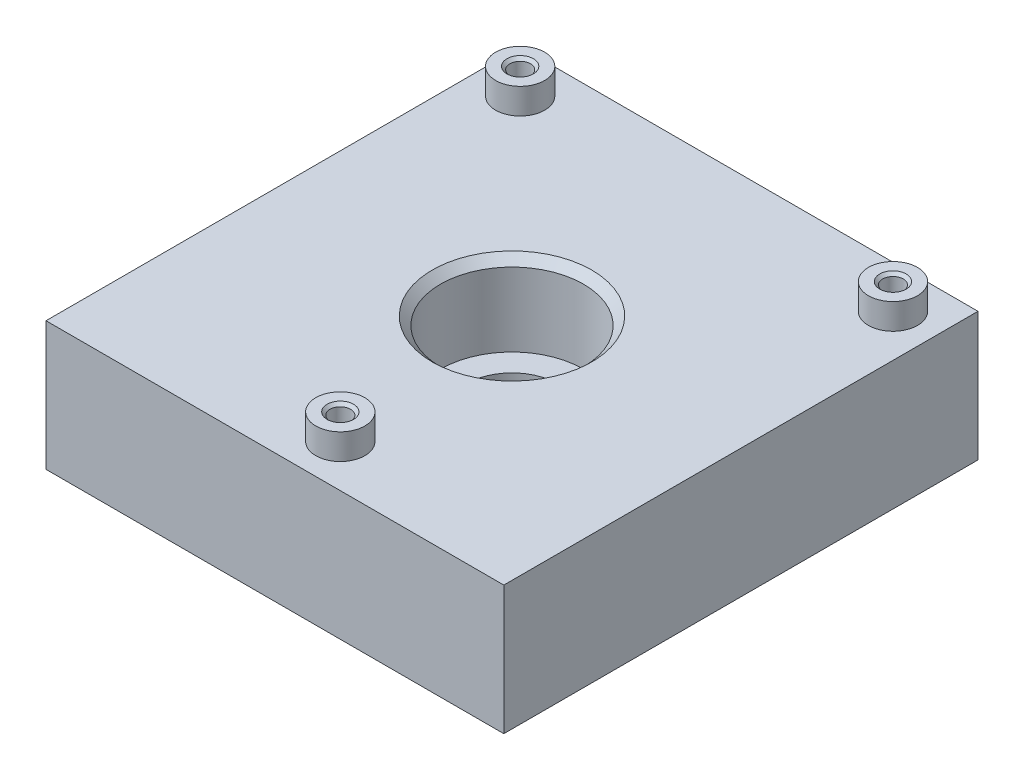
ISO-10303-21;
HEADER;
FILE_DESCRIPTION(('STEP AP214'),'2;1');
FILE_NAME('part.step','',(''),(''),'','','');
FILE_SCHEMA(('AUTOMOTIVE_DESIGN { 1 0 10303 214 1 1 1 1 }'));
ENDSEC;
DATA;
#1=APPLICATION_CONTEXT('core data for automotive mechanical design processes');
#2=APPLICATION_PROTOCOL_DEFINITION('international standard','automotive_design',2000,#1);
#3=PRODUCT_CONTEXT('',#1,'mechanical');
#4=PRODUCT('Part','Part','',(#3));
#5=PRODUCT_RELATED_PRODUCT_CATEGORY('part','',(#4));
#6=PRODUCT_DEFINITION_FORMATION('','',#4);
#7=PRODUCT_DEFINITION_CONTEXT('part definition',#1,'design');
#8=PRODUCT_DEFINITION('design','',#6,#7);
#9=PRODUCT_DEFINITION_SHAPE('','',#8);
#10=(LENGTH_UNIT() NAMED_UNIT(*) SI_UNIT(.MILLI.,.METRE.));
#11=(NAMED_UNIT(*) PLANE_ANGLE_UNIT() SI_UNIT($,.RADIAN.));
#12=(NAMED_UNIT(*) SI_UNIT($,.STERADIAN.) SOLID_ANGLE_UNIT());
#13=UNCERTAINTY_MEASURE_WITH_UNIT(LENGTH_MEASURE(1.E-05),#10,'distance_accuracy_value','');
#14=(GEOMETRIC_REPRESENTATION_CONTEXT(3) GLOBAL_UNCERTAINTY_ASSIGNED_CONTEXT((#13)) GLOBAL_UNIT_ASSIGNED_CONTEXT((#10,
#11,#12)) REPRESENTATION_CONTEXT('',''));
#15=CARTESIAN_POINT('',(0.,0.,0.));
#16=DIRECTION('',(0.,0.,1.));
#17=DIRECTION('',(1.,0.,0.));
#18=AXIS2_PLACEMENT_3D('',#15,#16,#17);
#19=CARTESIAN_POINT('',(17.78,10.,-18.415));
#20=DIRECTION('',(-1.,0.,0.));
#21=DIRECTION('',(0.,0.,1.));
#22=AXIS2_PLACEMENT_3D('',#19,#20,#21);
#23=PLANE('',#22);
#24=DIRECTION('',(0.,0.,-1.));
#25=VECTOR('',#24,1.);
#26=CARTESIAN_POINT('',(17.78,0.,-18.415));
#27=LINE('',#26,#25);
#28=CARTESIAN_POINT('',(17.78,0.,18.415));
#29=VERTEX_POINT('',#28);
#30=CARTESIAN_POINT('',(17.78,0.,-18.415));
#31=VERTEX_POINT('',#30);
#32=EDGE_CURVE('E111',#29,#31,#27,.T.);
#33=ORIENTED_EDGE('',*,*,#32,.T.);
#34=DIRECTION('',(0.,-1.,0.));
#35=VECTOR('',#34,1.);
#36=CARTESIAN_POINT('',(17.78,10.,-18.415));
#37=LINE('',#36,#35);
#38=CARTESIAN_POINT('',(17.78,10.,-18.415));
#39=VERTEX_POINT('',#38);
#40=EDGE_CURVE('E11',#39,#31,#37,.T.);
#41=ORIENTED_EDGE('',*,*,#40,.F.);
#42=DIRECTION('',(0.,0.,-1.));
#43=VECTOR('',#42,1.);
#44=CARTESIAN_POINT('',(17.78,10.,-18.415));
#45=LINE('',#44,#43);
#46=CARTESIAN_POINT('',(17.78,10.,18.415));
#47=VERTEX_POINT('',#46);
#48=EDGE_CURVE('E95',#47,#39,#45,.T.);
#49=ORIENTED_EDGE('',*,*,#48,.F.);
#50=DIRECTION('',(0.,-1.,0.));
#51=VECTOR('',#50,1.);
#52=CARTESIAN_POINT('',(17.78,10.,18.415));
#53=LINE('',#52,#51);
#54=EDGE_CURVE('E107',#47,#29,#53,.T.);
#55=ORIENTED_EDGE('',*,*,#54,.T.);
#56=EDGE_LOOP('',(#33,#41,#49,#55));
#57=FACE_BOUND('',#56,.T.);
#58=ADVANCED_FACE('F43',(#57),#23,.F.);
#59=CARTESIAN_POINT('',(-17.78,10.,-18.415));
#60=DIRECTION('',(0.,0.,1.));
#61=DIRECTION('',(1.,0.,0.));
#62=AXIS2_PLACEMENT_3D('',#59,#60,#61);
#63=PLANE('',#62);
#64=DIRECTION('',(-1.,0.,0.));
#65=VECTOR('',#64,1.);
#66=CARTESIAN_POINT('',(-17.78,0.,-18.415));
#67=LINE('',#66,#65);
#68=CARTESIAN_POINT('',(-17.78,0.,-18.415));
#69=VERTEX_POINT('',#68);
#70=EDGE_CURVE('E100',#31,#69,#67,.T.);
#71=ORIENTED_EDGE('',*,*,#70,.T.);
#72=DIRECTION('',(0.,-1.,0.));
#73=VECTOR('',#72,1.);
#74=CARTESIAN_POINT('',(-17.78,10.,-18.415));
#75=LINE('',#74,#73);
#76=CARTESIAN_POINT('',(-17.78,10.,-18.415));
#77=VERTEX_POINT('',#76);
#78=EDGE_CURVE('E52',#77,#69,#75,.T.);
#79=ORIENTED_EDGE('',*,*,#78,.F.);
#80=DIRECTION('',(-1.,0.,0.));
#81=VECTOR('',#80,1.);
#82=CARTESIAN_POINT('',(-17.78,10.,-18.415));
#83=LINE('',#82,#81);
#84=EDGE_CURVE('E90',#39,#77,#83,.T.);
#85=ORIENTED_EDGE('',*,*,#84,.F.);
#86=ORIENTED_EDGE('',*,*,#40,.T.);
#87=EDGE_LOOP('',(#71,#79,#85,#86));
#88=FACE_BOUND('',#87,.T.);
#89=ADVANCED_FACE('F99',(#88),#63,.F.);
#90=CARTESIAN_POINT('',(-17.78,10.,-18.415));
#91=DIRECTION('',(1.,0.,0.));
#92=DIRECTION('',(0.,0.,-1.));
#93=AXIS2_PLACEMENT_3D('',#90,#91,#92);
#94=PLANE('',#93);
#95=DIRECTION('',(0.,0.,1.));
#96=VECTOR('',#95,1.);
#97=CARTESIAN_POINT('',(-17.78,0.,-18.415));
#98=LINE('',#97,#96);
#99=CARTESIAN_POINT('',(-17.78,0.,18.415));
#100=VERTEX_POINT('',#99);
#101=EDGE_CURVE('E77',#69,#100,#98,.T.);
#102=ORIENTED_EDGE('',*,*,#101,.T.);
#103=DIRECTION('',(0.,-1.,0.));
#104=VECTOR('',#103,1.);
#105=CARTESIAN_POINT('',(-17.78,10.,18.415));
#106=LINE('',#105,#104);
#107=CARTESIAN_POINT('',(-17.78,10.,18.415));
#108=VERTEX_POINT('',#107);
#109=EDGE_CURVE('E102',#108,#100,#106,.T.);
#110=ORIENTED_EDGE('',*,*,#109,.F.);
#111=DIRECTION('',(0.,0.,1.));
#112=VECTOR('',#111,1.);
#113=CARTESIAN_POINT('',(-17.78,10.,-18.415));
#114=LINE('',#113,#112);
#115=EDGE_CURVE('E93',#77,#108,#114,.T.);
#116=ORIENTED_EDGE('',*,*,#115,.F.);
#117=ORIENTED_EDGE('',*,*,#78,.T.);
#118=EDGE_LOOP('',(#102,#110,#116,#117));
#119=FACE_BOUND('',#118,.T.);
#120=ADVANCED_FACE('F103',(#119),#94,.F.);
#121=CARTESIAN_POINT('',(-17.78,10.,18.415));
#122=DIRECTION('',(0.,0.,-1.));
#123=DIRECTION('',(-1.,0.,0.));
#124=AXIS2_PLACEMENT_3D('',#121,#122,#123);
#125=PLANE('',#124);
#126=DIRECTION('',(1.,0.,0.));
#127=VECTOR('',#126,1.);
#128=CARTESIAN_POINT('',(-17.78,0.,18.415));
#129=LINE('',#128,#127);
#130=EDGE_CURVE('E83',#100,#29,#129,.T.);
#131=ORIENTED_EDGE('',*,*,#130,.T.);
#132=ORIENTED_EDGE('',*,*,#54,.F.);
#133=DIRECTION('',(1.,0.,0.));
#134=VECTOR('',#133,1.);
#135=CARTESIAN_POINT('',(-17.78,10.,18.415));
#136=LINE('',#135,#134);
#137=EDGE_CURVE('E60',#108,#47,#136,.T.);
#138=ORIENTED_EDGE('',*,*,#137,.F.);
#139=ORIENTED_EDGE('',*,*,#109,.T.);
#140=EDGE_LOOP('',(#131,#132,#138,#139));
#141=FACE_BOUND('',#140,.T.);
#142=ADVANCED_FACE('F125',(#141),#125,.F.);
#143=CARTESIAN_POINT('',(0.,10.,0.));
#144=DIRECTION('',(0.,1.,0.));
#145=DIRECTION('',(0.,0.,1.));
#146=AXIS2_PLACEMENT_3D('',#143,#144,#145);
#147=PLANE('',#146);
#148=CARTESIAN_POINT('',(1.77800000000001,10.,15.113));
#149=DIRECTION('',(0.,1.,0.));
#150=DIRECTION('',(0.,0.,1.));
#151=AXIS2_PLACEMENT_3D('',#148,#149,#150);
#152=CIRCLE('',#151,1.905);
#153=CARTESIAN_POINT('',(1.77800000000001,10.,17.018));
#154=VERTEX_POINT('',#153);
#155=EDGE_CURVE('E168',#154,#154,#152,.T.);
#156=ORIENTED_EDGE('',*,*,#155,.F.);
#157=EDGE_LOOP('',(#156));
#158=FACE_BOUND('',#157,.T.);
#159=CARTESIAN_POINT('',(14.478,10.,-15.113));
#160=DIRECTION('',(0.,1.,0.));
#161=DIRECTION('',(0.,0.,1.));
#162=AXIS2_PLACEMENT_3D('',#159,#160,#161);
#163=CIRCLE('',#162,1.905);
#164=CARTESIAN_POINT('',(14.478,10.,-13.208));
#165=VERTEX_POINT('',#164);
#166=EDGE_CURVE('E160',#165,#165,#163,.T.);
#167=ORIENTED_EDGE('',*,*,#166,.F.);
#168=EDGE_LOOP('',(#167));
#169=FACE_BOUND('',#168,.T.);
#170=CARTESIAN_POINT('',(-14.478,10.,-15.113));
#171=DIRECTION('',(0.,1.,0.));
#172=DIRECTION('',(0.,0.,1.));
#173=AXIS2_PLACEMENT_3D('',#170,#171,#172);
#174=CIRCLE('',#173,1.905);
#175=CARTESIAN_POINT('',(-14.478,10.,-13.208));
#176=VERTEX_POINT('',#175);
#177=EDGE_CURVE('E152',#176,#176,#174,.T.);
#178=ORIENTED_EDGE('',*,*,#177,.F.);
#179=EDGE_LOOP('',(#178));
#180=FACE_BOUND('',#179,.T.);
#181=CARTESIAN_POINT('',(0.,10.,0.));
#182=DIRECTION('',(0.,1.,0.));
#183=DIRECTION('',(0.,0.,1.));
#184=AXIS2_PLACEMENT_3D('',#181,#182,#183);
#185=CIRCLE('',#184,6.19125);
#186=CARTESIAN_POINT('',(0.,10.,6.19125));
#187=VERTEX_POINT('',#186);
#188=EDGE_CURVE('E147',#187,#187,#185,.T.);
#189=ORIENTED_EDGE('',*,*,#188,.F.);
#190=EDGE_LOOP('',(#189));
#191=FACE_BOUND('',#190,.T.);
#192=ORIENTED_EDGE('',*,*,#48,.T.);
#193=ORIENTED_EDGE('',*,*,#84,.T.);
#194=ORIENTED_EDGE('',*,*,#115,.T.);
#195=ORIENTED_EDGE('',*,*,#137,.T.);
#196=EDGE_LOOP('',(#192,#193,#194,#195));
#197=FACE_BOUND('',#196,.T.);
#198=ADVANCED_FACE('F91',(#158,#169,#180,#191,#197),#147,.T.);
#199=CARTESIAN_POINT('',(0.,0.,0.));
#200=DIRECTION('',(0.,1.,0.));
#201=DIRECTION('',(0.,0.,1.));
#202=AXIS2_PLACEMENT_3D('',#199,#200,#201);
#203=PLANE('',#202);
#204=CARTESIAN_POINT('',(-14.478,0.,-15.113));
#205=DIRECTION('',(0.,1.,0.));
#206=DIRECTION('',(0.,0.,1.));
#207=AXIS2_PLACEMENT_3D('',#204,#205,#206);
#208=CIRCLE('',#207,0.799999999999997);
#209=CARTESIAN_POINT('',(-14.478,0.,-14.313));
#210=VERTEX_POINT('',#209);
#211=EDGE_CURVE('E199',#210,#210,#208,.T.);
#212=ORIENTED_EDGE('',*,*,#211,.T.);
#213=EDGE_LOOP('',(#212));
#214=FACE_BOUND('',#213,.T.);
#215=CARTESIAN_POINT('',(14.478,0.,-15.113));
#216=DIRECTION('',(0.,1.,0.));
#217=DIRECTION('',(0.,0.,1.));
#218=AXIS2_PLACEMENT_3D('',#215,#216,#217);
#219=CIRCLE('',#218,0.799999999999997);
#220=CARTESIAN_POINT('',(14.478,0.,-14.313));
#221=VERTEX_POINT('',#220);
#222=EDGE_CURVE('E187',#221,#221,#219,.T.);
#223=ORIENTED_EDGE('',*,*,#222,.T.);
#224=EDGE_LOOP('',(#223));
#225=FACE_BOUND('',#224,.T.);
#226=CARTESIAN_POINT('',(1.77800000000001,0.,15.113));
#227=DIRECTION('',(0.,1.,0.));
#228=DIRECTION('',(0.,0.,1.));
#229=AXIS2_PLACEMENT_3D('',#226,#227,#228);
#230=CIRCLE('',#229,0.799999999999997);
#231=CARTESIAN_POINT('',(1.77800000000001,0.,15.913));
#232=VERTEX_POINT('',#231);
#233=EDGE_CURVE('E172',#232,#232,#230,.T.);
#234=ORIENTED_EDGE('',*,*,#233,.T.);
#235=EDGE_LOOP('',(#234));
#236=FACE_BOUND('',#235,.T.);
#237=CARTESIAN_POINT('',(0.,0.,0.));
#238=DIRECTION('',(0.,1.,0.));
#239=DIRECTION('',(0.,0.,1.));
#240=AXIS2_PLACEMENT_3D('',#237,#238,#239);
#241=CIRCLE('',#240,3.57124);
#242=CARTESIAN_POINT('',(0.,0.,3.57124));
#243=VERTEX_POINT('',#242);
#244=EDGE_CURVE('E115',#243,#243,#241,.T.);
#245=ORIENTED_EDGE('',*,*,#244,.T.);
#246=EDGE_LOOP('',(#245));
#247=FACE_BOUND('',#246,.T.);
#248=ORIENTED_EDGE('',*,*,#32,.F.);
#249=ORIENTED_EDGE('',*,*,#130,.F.);
#250=ORIENTED_EDGE('',*,*,#101,.F.);
#251=ORIENTED_EDGE('',*,*,#70,.F.);
#252=EDGE_LOOP('',(#248,#249,#250,#251));
#253=FACE_BOUND('',#252,.T.);
#254=ADVANCED_FACE('F128',(#214,#225,#236,#247,#253),#203,.F.);
#255=CARTESIAN_POINT('',(0.,10.,0.));
#256=DIRECTION('',(0.,1.,0.));
#257=DIRECTION('',(0.,0.,1.));
#258=AXIS2_PLACEMENT_3D('',#255,#256,#257);
#259=CYLINDRICAL_SURFACE('',#258,3.57124);
#260=ORIENTED_EDGE('',*,*,#244,.F.);
#261=EDGE_LOOP('',(#260));
#262=FACE_BOUND('',#261,.T.);
#263=CARTESIAN_POINT('',(0.,3.65,0.));
#264=DIRECTION('',(0.,1.,0.));
#265=DIRECTION('',(0.,0.,1.));
#266=AXIS2_PLACEMENT_3D('',#263,#264,#265);
#267=CIRCLE('',#266,3.57124);
#268=CARTESIAN_POINT('',(0.,3.65,3.57124));
#269=VERTEX_POINT('',#268);
#270=EDGE_CURVE('E135',#269,#269,#267,.T.);
#271=ORIENTED_EDGE('',*,*,#270,.T.);
#272=EDGE_LOOP('',(#271));
#273=FACE_BOUND('',#272,.T.);
#274=ADVANCED_FACE('F257',(#262,#273),#259,.F.);
#275=CARTESIAN_POINT('',(5.55625,3.65,0.));
#276=DIRECTION('',(0.,-1.,0.));
#277=DIRECTION('',(0.,0.,-1.));
#278=AXIS2_PLACEMENT_3D('',#275,#276,#277);
#279=PLANE('',#278);
#280=ORIENTED_EDGE('',*,*,#270,.F.);
#281=EDGE_LOOP('',(#280));
#282=FACE_BOUND('',#281,.T.);
#283=CARTESIAN_POINT('',(0.,3.65,0.));
#284=DIRECTION('',(0.,1.,0.));
#285=DIRECTION('',(0.,0.,1.));
#286=AXIS2_PLACEMENT_3D('',#283,#284,#285);
#287=CIRCLE('',#286,5.55625);
#288=CARTESIAN_POINT('',(0.,3.65,5.55625));
#289=VERTEX_POINT('',#288);
#290=EDGE_CURVE('E139',#289,#289,#287,.T.);
#291=ORIENTED_EDGE('',*,*,#290,.T.);
#292=EDGE_LOOP('',(#291));
#293=FACE_BOUND('',#292,.T.);
#294=ADVANCED_FACE('F241',(#282,#293),#279,.F.);
#295=CARTESIAN_POINT('',(0.,10.,0.));
#296=DIRECTION('',(0.,1.,0.));
#297=DIRECTION('',(0.,0.,1.));
#298=AXIS2_PLACEMENT_3D('',#295,#296,#297);
#299=CYLINDRICAL_SURFACE('',#298,5.55625);
#300=ORIENTED_EDGE('',*,*,#290,.F.);
#301=EDGE_LOOP('',(#300));
#302=FACE_BOUND('',#301,.T.);
#303=CARTESIAN_POINT('',(0.,9.365,0.));
#304=DIRECTION('',(0.,1.,0.));
#305=DIRECTION('',(0.,0.,1.));
#306=AXIS2_PLACEMENT_3D('',#303,#304,#305);
#307=CIRCLE('',#306,5.55625);
#308=CARTESIAN_POINT('',(0.,9.365,5.55625));
#309=VERTEX_POINT('',#308);
#310=EDGE_CURVE('E143',#309,#309,#307,.T.);
#311=ORIENTED_EDGE('',*,*,#310,.T.);
#312=EDGE_LOOP('',(#311));
#313=FACE_BOUND('',#312,.T.);
#314=ADVANCED_FACE('F235',(#302,#313),#299,.F.);
#315=CARTESIAN_POINT('',(0.,10.,0.));
#316=DIRECTION('',(0.,1.,0.));
#317=DIRECTION('',(0.,0.,1.));
#318=AXIS2_PLACEMENT_3D('',#315,#316,#317);
#319=CONICAL_SURFACE('',#318,6.19125,0.78539816339745);
#320=ORIENTED_EDGE('',*,*,#310,.F.);
#321=EDGE_LOOP('',(#320));
#322=FACE_BOUND('',#321,.T.);
#323=ORIENTED_EDGE('',*,*,#188,.T.);
#324=EDGE_LOOP('',(#323));
#325=FACE_BOUND('',#324,.T.);
#326=ADVANCED_FACE('F224',(#322,#325),#319,.F.);
#327=CARTESIAN_POINT('',(-14.478,12.,-15.113));
#328=DIRECTION('',(0.,-1.,0.));
#329=DIRECTION('',(0.,0.,-1.));
#330=AXIS2_PLACEMENT_3D('',#327,#328,#329);
#331=CYLINDRICAL_SURFACE('',#330,1.905);
#332=CARTESIAN_POINT('',(-14.478,12.,-15.113));
#333=DIRECTION('',(0.,1.,0.));
#334=DIRECTION('',(0.,0.,1.));
#335=AXIS2_PLACEMENT_3D('',#332,#333,#334);
#336=CIRCLE('',#335,1.905);
#337=CARTESIAN_POINT('',(-14.478,12.,-13.208));
#338=VERTEX_POINT('',#337);
#339=EDGE_CURVE('E151',#338,#338,#336,.T.);
#340=ORIENTED_EDGE('',*,*,#339,.F.);
#341=EDGE_LOOP('',(#340));
#342=FACE_BOUND('',#341,.T.);
#343=ORIENTED_EDGE('',*,*,#177,.T.);
#344=EDGE_LOOP('',(#343));
#345=FACE_BOUND('',#344,.T.);
#346=ADVANCED_FACE('F218',(#342,#345),#331,.T.);
#347=CARTESIAN_POINT('',(-14.478,12.,-15.113));
#348=DIRECTION('',(0.,1.,0.));
#349=DIRECTION('',(0.,0.,1.));
#350=AXIS2_PLACEMENT_3D('',#347,#348,#349);
#351=PLANE('',#350);
#352=CARTESIAN_POINT('',(-14.478,12.,-15.113));
#353=DIRECTION('',(0.,1.,0.));
#354=DIRECTION('',(0.,0.,1.));
#355=AXIS2_PLACEMENT_3D('',#352,#353,#354);
#356=CIRCLE('',#355,1.025);
#357=CARTESIAN_POINT('',(-14.478,12.,-14.088));
#358=VERTEX_POINT('',#357);
#359=EDGE_CURVE('E207',#358,#358,#356,.T.);
#360=ORIENTED_EDGE('',*,*,#359,.F.);
#361=EDGE_LOOP('',(#360));
#362=FACE_BOUND('',#361,.T.);
#363=ORIENTED_EDGE('',*,*,#339,.T.);
#364=EDGE_LOOP('',(#363));
#365=FACE_BOUND('',#364,.T.);
#366=ADVANCED_FACE('F214',(#362,#365),#351,.T.);
#367=CARTESIAN_POINT('',(14.478,12.,-15.113));
#368=DIRECTION('',(0.,-1.,0.));
#369=DIRECTION('',(0.,0.,-1.));
#370=AXIS2_PLACEMENT_3D('',#367,#368,#369);
#371=CYLINDRICAL_SURFACE('',#370,1.905);
#372=CARTESIAN_POINT('',(14.478,12.,-15.113));
#373=DIRECTION('',(0.,1.,0.));
#374=DIRECTION('',(0.,0.,1.));
#375=AXIS2_PLACEMENT_3D('',#372,#373,#374);
#376=CIRCLE('',#375,1.905);
#377=CARTESIAN_POINT('',(14.478,12.,-13.208));
#378=VERTEX_POINT('',#377);
#379=EDGE_CURVE('E156',#378,#378,#376,.T.);
#380=ORIENTED_EDGE('',*,*,#379,.F.);
#381=EDGE_LOOP('',(#380));
#382=FACE_BOUND('',#381,.T.);
#383=ORIENTED_EDGE('',*,*,#166,.T.);
#384=EDGE_LOOP('',(#383));
#385=FACE_BOUND('',#384,.T.);
#386=ADVANCED_FACE('F217',(#382,#385),#371,.T.);
#387=CARTESIAN_POINT('',(14.478,12.,-15.113));
#388=DIRECTION('',(0.,1.,0.));
#389=DIRECTION('',(0.,0.,1.));
#390=AXIS2_PLACEMENT_3D('',#387,#388,#389);
#391=PLANE('',#390);
#392=CARTESIAN_POINT('',(14.478,12.,-15.113));
#393=DIRECTION('',(0.,1.,0.));
#394=DIRECTION('',(0.,0.,1.));
#395=AXIS2_PLACEMENT_3D('',#392,#393,#394);
#396=CIRCLE('',#395,1.025);
#397=CARTESIAN_POINT('',(14.478,12.,-14.088));
#398=VERTEX_POINT('',#397);
#399=EDGE_CURVE('E195',#398,#398,#396,.T.);
#400=ORIENTED_EDGE('',*,*,#399,.F.);
#401=EDGE_LOOP('',(#400));
#402=FACE_BOUND('',#401,.T.);
#403=ORIENTED_EDGE('',*,*,#379,.T.);
#404=EDGE_LOOP('',(#403));
#405=FACE_BOUND('',#404,.T.);
#406=ADVANCED_FACE('F306',(#402,#405),#391,.T.);
#407=CARTESIAN_POINT('',(1.77800000000001,12.,15.113));
#408=DIRECTION('',(0.,-1.,0.));
#409=DIRECTION('',(0.,0.,-1.));
#410=AXIS2_PLACEMENT_3D('',#407,#408,#409);
#411=CYLINDRICAL_SURFACE('',#410,1.905);
#412=CARTESIAN_POINT('',(1.77800000000001,12.,15.113));
#413=DIRECTION('',(0.,1.,0.));
#414=DIRECTION('',(0.,0.,1.));
#415=AXIS2_PLACEMENT_3D('',#412,#413,#414);
#416=CIRCLE('',#415,1.905);
#417=CARTESIAN_POINT('',(1.77800000000001,12.,17.018));
#418=VERTEX_POINT('',#417);
#419=EDGE_CURVE('E164',#418,#418,#416,.T.);
#420=ORIENTED_EDGE('',*,*,#419,.F.);
#421=EDGE_LOOP('',(#420));
#422=FACE_BOUND('',#421,.T.);
#423=ORIENTED_EDGE('',*,*,#155,.T.);
#424=EDGE_LOOP('',(#423));
#425=FACE_BOUND('',#424,.T.);
#426=ADVANCED_FACE('F314',(#422,#425),#411,.T.);
#427=CARTESIAN_POINT('',(1.77800000000001,12.,15.113));
#428=DIRECTION('',(0.,1.,0.));
#429=DIRECTION('',(0.,0.,1.));
#430=AXIS2_PLACEMENT_3D('',#427,#428,#429);
#431=PLANE('',#430);
#432=CARTESIAN_POINT('',(1.77800000000001,12.,15.113));
#433=DIRECTION('',(0.,1.,0.));
#434=DIRECTION('',(0.,0.,1.));
#435=AXIS2_PLACEMENT_3D('',#432,#433,#434);
#436=CIRCLE('',#435,1.025);
#437=CARTESIAN_POINT('',(1.77800000000001,12.,16.138));
#438=VERTEX_POINT('',#437);
#439=EDGE_CURVE('E183',#438,#438,#436,.T.);
#440=ORIENTED_EDGE('',*,*,#439,.F.);
#441=EDGE_LOOP('',(#440));
#442=FACE_BOUND('',#441,.T.);
#443=ORIENTED_EDGE('',*,*,#419,.T.);
#444=EDGE_LOOP('',(#443));
#445=FACE_BOUND('',#444,.T.);
#446=ADVANCED_FACE('F319',(#442,#445),#431,.T.);
#447=CARTESIAN_POINT('',(1.77800000000001,12.,15.113));
#448=DIRECTION('',(0.,1.,0.));
#449=DIRECTION('',(0.,0.,1.));
#450=AXIS2_PLACEMENT_3D('',#447,#448,#449);
#451=CYLINDRICAL_SURFACE('',#450,0.799999999999998);
#452=ORIENTED_EDGE('',*,*,#233,.F.);
#453=EDGE_LOOP('',(#452));
#454=FACE_BOUND('',#453,.T.);
#455=CARTESIAN_POINT('',(1.77800000000001,11.775,15.113));
#456=DIRECTION('',(0.,1.,0.));
#457=DIRECTION('',(0.,0.,1.));
#458=AXIS2_PLACEMENT_3D('',#455,#456,#457);
#459=CIRCLE('',#458,0.799999999999999);
#460=CARTESIAN_POINT('',(1.77800000000001,11.775,15.913));
#461=VERTEX_POINT('',#460);
#462=EDGE_CURVE('E179',#461,#461,#459,.T.);
#463=ORIENTED_EDGE('',*,*,#462,.T.);
#464=EDGE_LOOP('',(#463));
#465=FACE_BOUND('',#464,.T.);
#466=ADVANCED_FACE('F347',(#454,#465),#451,.F.);
#467=CARTESIAN_POINT('',(1.77800000000001,12.,15.113));
#468=DIRECTION('',(0.,1.,0.));
#469=DIRECTION('',(0.,0.,1.));
#470=AXIS2_PLACEMENT_3D('',#467,#468,#469);
#471=CONICAL_SURFACE('',#470,1.025,0.785398163397448);
#472=ORIENTED_EDGE('',*,*,#462,.F.);
#473=EDGE_LOOP('',(#472));
#474=FACE_BOUND('',#473,.T.);
#475=ORIENTED_EDGE('',*,*,#439,.T.);
#476=EDGE_LOOP('',(#475));
#477=FACE_BOUND('',#476,.T.);
#478=ADVANCED_FACE('F358',(#474,#477),#471,.F.);
#479=CARTESIAN_POINT('',(14.478,12.,-15.113));
#480=DIRECTION('',(0.,1.,0.));
#481=DIRECTION('',(0.,0.,1.));
#482=AXIS2_PLACEMENT_3D('',#479,#480,#481);
#483=CYLINDRICAL_SURFACE('',#482,0.799999999999998);
#484=ORIENTED_EDGE('',*,*,#222,.F.);
#485=EDGE_LOOP('',(#484));
#486=FACE_BOUND('',#485,.T.);
#487=CARTESIAN_POINT('',(14.478,11.775,-15.113));
#488=DIRECTION('',(0.,1.,0.));
#489=DIRECTION('',(0.,0.,1.));
#490=AXIS2_PLACEMENT_3D('',#487,#488,#489);
#491=CIRCLE('',#490,0.799999999999999);
#492=CARTESIAN_POINT('',(14.478,11.775,-14.313));
#493=VERTEX_POINT('',#492);
#494=EDGE_CURVE('E191',#493,#493,#491,.T.);
#495=ORIENTED_EDGE('',*,*,#494,.T.);
#496=EDGE_LOOP('',(#495));
#497=FACE_BOUND('',#496,.T.);
#498=ADVANCED_FACE('F371',(#486,#497),#483,.F.);
#499=CARTESIAN_POINT('',(14.478,12.,-15.113));
#500=DIRECTION('',(0.,1.,0.));
#501=DIRECTION('',(0.,0.,1.));
#502=AXIS2_PLACEMENT_3D('',#499,#500,#501);
#503=CONICAL_SURFACE('',#502,1.025,0.785398163397448);
#504=ORIENTED_EDGE('',*,*,#494,.F.);
#505=EDGE_LOOP('',(#504));
#506=FACE_BOUND('',#505,.T.);
#507=ORIENTED_EDGE('',*,*,#399,.T.);
#508=EDGE_LOOP('',(#507));
#509=FACE_BOUND('',#508,.T.);
#510=ADVANCED_FACE('F382',(#506,#509),#503,.F.);
#511=CARTESIAN_POINT('',(-14.478,12.,-15.113));
#512=DIRECTION('',(0.,1.,0.));
#513=DIRECTION('',(0.,0.,1.));
#514=AXIS2_PLACEMENT_3D('',#511,#512,#513);
#515=CYLINDRICAL_SURFACE('',#514,0.799999999999998);
#516=ORIENTED_EDGE('',*,*,#211,.F.);
#517=EDGE_LOOP('',(#516));
#518=FACE_BOUND('',#517,.T.);
#519=CARTESIAN_POINT('',(-14.478,11.775,-15.113));
#520=DIRECTION('',(0.,1.,0.));
#521=DIRECTION('',(0.,0.,1.));
#522=AXIS2_PLACEMENT_3D('',#519,#520,#521);
#523=CIRCLE('',#522,0.799999999999999);
#524=CARTESIAN_POINT('',(-14.478,11.775,-14.313));
#525=VERTEX_POINT('',#524);
#526=EDGE_CURVE('E203',#525,#525,#523,.T.);
#527=ORIENTED_EDGE('',*,*,#526,.T.);
#528=EDGE_LOOP('',(#527));
#529=FACE_BOUND('',#528,.T.);
#530=ADVANCED_FACE('F394',(#518,#529),#515,.F.);
#531=CARTESIAN_POINT('',(-14.478,12.,-15.113));
#532=DIRECTION('',(0.,1.,0.));
#533=DIRECTION('',(0.,0.,1.));
#534=AXIS2_PLACEMENT_3D('',#531,#532,#533);
#535=CONICAL_SURFACE('',#534,1.025,0.785398163397448);
#536=ORIENTED_EDGE('',*,*,#526,.F.);
#537=EDGE_LOOP('',(#536));
#538=FACE_BOUND('',#537,.T.);
#539=ORIENTED_EDGE('',*,*,#359,.T.);
#540=EDGE_LOOP('',(#539));
#541=FACE_BOUND('',#540,.T.);
#542=ADVANCED_FACE('F212',(#538,#541),#535,.F.);
#543=CLOSED_SHELL('',(#58,#89,#120,#142,#198,#254,#274,#294,#314,#326,#346,#366,#386,#406,#426,
#446,#466,#478,#498,#510,#530,#542));
#544=MANIFOLD_SOLID_BREP('B2',#543);
#545=ADVANCED_BREP_SHAPE_REPRESENTATION('',(#18,#544),#14);
#546=SHAPE_DEFINITION_REPRESENTATION(#9,#545);
ENDSEC;
END-ISO-10303-21;
